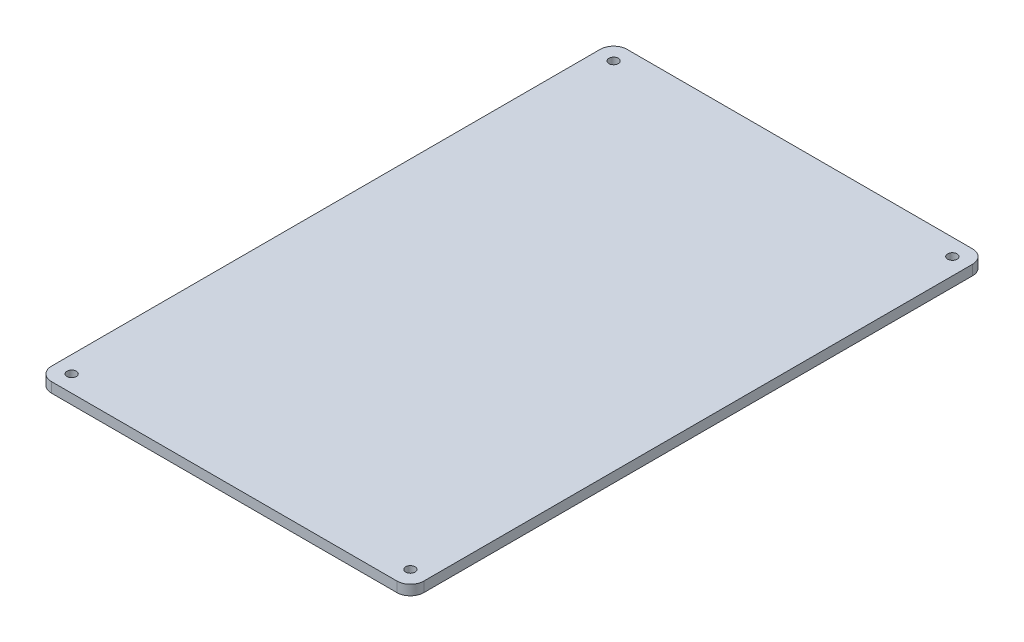
ISO-10303-21;
HEADER;
FILE_DESCRIPTION(('STEP AP214'),'2;1');
FILE_NAME('part.step','',(''),(''),'','','');
FILE_SCHEMA(('AUTOMOTIVE_DESIGN { 1 0 10303 214 1 1 1 1 }'));
ENDSEC;
DATA;
#1=APPLICATION_CONTEXT('core data for automotive mechanical design processes');
#2=APPLICATION_PROTOCOL_DEFINITION('international standard','automotive_design',2000,#1);
#3=PRODUCT_CONTEXT('',#1,'mechanical');
#4=PRODUCT('Part','Part','',(#3));
#5=PRODUCT_RELATED_PRODUCT_CATEGORY('part','',(#4));
#6=PRODUCT_DEFINITION_FORMATION('','',#4);
#7=PRODUCT_DEFINITION_CONTEXT('part definition',#1,'design');
#8=PRODUCT_DEFINITION('design','',#6,#7);
#9=PRODUCT_DEFINITION_SHAPE('','',#8);
#10=(LENGTH_UNIT() NAMED_UNIT(*) SI_UNIT(.MILLI.,.METRE.));
#11=(NAMED_UNIT(*) PLANE_ANGLE_UNIT() SI_UNIT($,.RADIAN.));
#12=(NAMED_UNIT(*) SI_UNIT($,.STERADIAN.) SOLID_ANGLE_UNIT());
#13=UNCERTAINTY_MEASURE_WITH_UNIT(LENGTH_MEASURE(1.E-05),#10,'distance_accuracy_value','');
#14=(GEOMETRIC_REPRESENTATION_CONTEXT(3) GLOBAL_UNCERTAINTY_ASSIGNED_CONTEXT((#13)) GLOBAL_UNIT_ASSIGNED_CONTEXT((#10,
#11,#12)) REPRESENTATION_CONTEXT('',''));
#15=CARTESIAN_POINT('',(0.,0.,0.));
#16=DIRECTION('',(0.,0.,1.));
#17=DIRECTION('',(1.,0.,0.));
#18=AXIS2_PLACEMENT_3D('',#15,#16,#17);
#19=CARTESIAN_POINT('',(-51.5,3.,-80.5789626486851));
#20=DIRECTION('',(0.,-1.,0.));
#21=DIRECTION('',(0.,0.,-1.));
#22=AXIS2_PLACEMENT_3D('',#19,#20,#21);
#23=CYLINDRICAL_SURFACE('',#22,4.);
#24=CARTESIAN_POINT('',(-51.5,0.,-80.5789626486851));
#25=DIRECTION('',(0.,1.,0.));
#26=DIRECTION('',(0.,0.,1.));
#27=AXIS2_PLACEMENT_3D('',#24,#25,#26);
#28=CIRCLE('',#27,4.);
#29=CARTESIAN_POINT('',(-55.5,0.,-80.578962648685));
#30=VERTEX_POINT('',#29);
#31=CARTESIAN_POINT('',(-51.5,0.,-84.5789626486851));
#32=VERTEX_POINT('',#31);
#33=EDGE_CURVE('E141',#30,#32,#28,.F.);
#34=ORIENTED_EDGE('',*,*,#33,.F.);
#35=DIRECTION('',(0.,-1.,0.));
#36=VECTOR('',#35,1.);
#37=CARTESIAN_POINT('',(-55.5,3.,-80.578962648685));
#38=LINE('',#37,#36);
#39=CARTESIAN_POINT('',(-55.5,3.,-80.578962648685));
#40=VERTEX_POINT('',#39);
#41=EDGE_CURVE('E11',#40,#30,#38,.T.);
#42=ORIENTED_EDGE('',*,*,#41,.F.);
#43=CARTESIAN_POINT('',(-51.5,3.,-80.5789626486851));
#44=DIRECTION('',(0.,1.,0.));
#45=DIRECTION('',(0.,0.,1.));
#46=AXIS2_PLACEMENT_3D('',#43,#44,#45);
#47=CIRCLE('',#46,4.);
#48=CARTESIAN_POINT('',(-51.5,3.,-84.5789626486851));
#49=VERTEX_POINT('',#48);
#50=EDGE_CURVE('E168',#40,#49,#47,.F.);
#51=ORIENTED_EDGE('',*,*,#50,.T.);
#52=DIRECTION('',(0.,-1.,0.));
#53=VECTOR('',#52,1.);
#54=CARTESIAN_POINT('',(-51.5,3.,-84.5789626486851));
#55=LINE('',#54,#53);
#56=EDGE_CURVE('E86',#49,#32,#55,.T.);
#57=ORIENTED_EDGE('',*,*,#56,.T.);
#58=EDGE_LOOP('',(#34,#42,#51,#57));
#59=FACE_BOUND('',#58,.T.);
#60=ADVANCED_FACE('F35',(#59),#23,.T.);
#61=CARTESIAN_POINT('',(-55.5,3.,0.));
#62=DIRECTION('',(1.,0.,0.));
#63=DIRECTION('',(0.,0.,-1.));
#64=AXIS2_PLACEMENT_3D('',#61,#62,#63);
#65=PLANE('',#64);
#66=DIRECTION('',(0.,0.,1.));
#67=VECTOR('',#66,1.);
#68=CARTESIAN_POINT('',(-55.5,0.,0.));
#69=LINE('',#68,#67);
#70=CARTESIAN_POINT('',(-55.5,0.,83.0177691164296));
#71=VERTEX_POINT('',#70);
#72=EDGE_CURVE('E144',#30,#71,#69,.T.);
#73=ORIENTED_EDGE('',*,*,#72,.T.);
#74=DIRECTION('',(0.,-1.,0.));
#75=VECTOR('',#74,1.);
#76=CARTESIAN_POINT('',(-55.5,3.,83.0177691164296));
#77=LINE('',#76,#75);
#78=CARTESIAN_POINT('',(-55.5,3.,83.0177691164296));
#79=VERTEX_POINT('',#78);
#80=EDGE_CURVE('E43',#79,#71,#77,.T.);
#81=ORIENTED_EDGE('',*,*,#80,.F.);
#82=DIRECTION('',(0.,0.,1.));
#83=VECTOR('',#82,1.);
#84=CARTESIAN_POINT('',(-55.5,3.,0.));
#85=LINE('',#84,#83);
#86=EDGE_CURVE('E202',#40,#79,#85,.T.);
#87=ORIENTED_EDGE('',*,*,#86,.F.);
#88=ORIENTED_EDGE('',*,*,#41,.T.);
#89=EDGE_LOOP('',(#73,#81,#87,#88));
#90=FACE_BOUND('',#89,.T.);
#91=ADVANCED_FACE('F204',(#90),#65,.F.);
#92=CARTESIAN_POINT('',(-51.5,3.,83.0177691164297));
#93=DIRECTION('',(0.,-1.,0.));
#94=DIRECTION('',(0.,0.,-1.));
#95=AXIS2_PLACEMENT_3D('',#92,#93,#94);
#96=CYLINDRICAL_SURFACE('',#95,4.);
#97=CARTESIAN_POINT('',(-51.5,0.,83.0177691164297));
#98=DIRECTION('',(0.,1.,0.));
#99=DIRECTION('',(0.,0.,1.));
#100=AXIS2_PLACEMENT_3D('',#97,#98,#99);
#101=CIRCLE('',#100,4.);
#102=CARTESIAN_POINT('',(-51.5,0.,87.0177691164297));
#103=VERTEX_POINT('',#102);
#104=EDGE_CURVE('E146',#71,#103,#101,.T.);
#105=ORIENTED_EDGE('',*,*,#104,.T.);
#106=DIRECTION('',(0.,-1.,0.));
#107=VECTOR('',#106,1.);
#108=CARTESIAN_POINT('',(-51.5,3.,87.0177691164297));
#109=LINE('',#108,#107);
#110=CARTESIAN_POINT('',(-51.5,3.,87.0177691164297));
#111=VERTEX_POINT('',#110);
#112=EDGE_CURVE('E175',#111,#103,#109,.T.);
#113=ORIENTED_EDGE('',*,*,#112,.F.);
#114=CARTESIAN_POINT('',(-51.5,3.,83.0177691164297));
#115=DIRECTION('',(0.,1.,0.));
#116=DIRECTION('',(0.,0.,1.));
#117=AXIS2_PLACEMENT_3D('',#114,#115,#116);
#118=CIRCLE('',#117,4.);
#119=EDGE_CURVE('E184',#79,#111,#118,.T.);
#120=ORIENTED_EDGE('',*,*,#119,.F.);
#121=ORIENTED_EDGE('',*,*,#80,.T.);
#122=EDGE_LOOP('',(#105,#113,#120,#121));
#123=FACE_BOUND('',#122,.T.);
#124=ADVANCED_FACE('F182',(#123),#96,.T.);
#125=CARTESIAN_POINT('',(0.,3.,87.0177691164297));
#126=DIRECTION('',(0.,0.,-1.));
#127=DIRECTION('',(-1.,0.,0.));
#128=AXIS2_PLACEMENT_3D('',#125,#126,#127);
#129=PLANE('',#128);
#130=DIRECTION('',(1.,0.,0.));
#131=VECTOR('',#130,1.);
#132=CARTESIAN_POINT('',(0.,0.,87.0177691164297));
#133=LINE('',#132,#131);
#134=CARTESIAN_POINT('',(51.5,0.,87.0177691164297));
#135=VERTEX_POINT('',#134);
#136=EDGE_CURVE('E148',#103,#135,#133,.T.);
#137=ORIENTED_EDGE('',*,*,#136,.T.);
#138=DIRECTION('',(0.,-1.,0.));
#139=VECTOR('',#138,1.);
#140=CARTESIAN_POINT('',(51.5,3.,87.0177691164297));
#141=LINE('',#140,#139);
#142=CARTESIAN_POINT('',(51.5,3.,87.0177691164297));
#143=VERTEX_POINT('',#142);
#144=EDGE_CURVE('E172',#143,#135,#141,.T.);
#145=ORIENTED_EDGE('',*,*,#144,.F.);
#146=DIRECTION('',(1.,0.,0.));
#147=VECTOR('',#146,1.);
#148=CARTESIAN_POINT('',(0.,3.,87.0177691164297));
#149=LINE('',#148,#147);
#150=EDGE_CURVE('E198',#111,#143,#149,.T.);
#151=ORIENTED_EDGE('',*,*,#150,.F.);
#152=ORIENTED_EDGE('',*,*,#112,.T.);
#153=EDGE_LOOP('',(#137,#145,#151,#152));
#154=FACE_BOUND('',#153,.T.);
#155=ADVANCED_FACE('F194',(#154),#129,.F.);
#156=CARTESIAN_POINT('',(51.5,3.,83.0177691164297));
#157=DIRECTION('',(0.,-1.,0.));
#158=DIRECTION('',(0.,0.,-1.));
#159=AXIS2_PLACEMENT_3D('',#156,#157,#158);
#160=CYLINDRICAL_SURFACE('',#159,4.);
#161=CARTESIAN_POINT('',(51.5,0.,83.0177691164297));
#162=DIRECTION('',(0.,1.,0.));
#163=DIRECTION('',(0.,0.,1.));
#164=AXIS2_PLACEMENT_3D('',#161,#162,#163);
#165=CIRCLE('',#164,4.);
#166=CARTESIAN_POINT('',(55.5,0.,83.0177691164296));
#167=VERTEX_POINT('',#166);
#168=EDGE_CURVE('E150',#135,#167,#165,.T.);
#169=ORIENTED_EDGE('',*,*,#168,.T.);
#170=DIRECTION('',(0.,-1.,0.));
#171=VECTOR('',#170,1.);
#172=CARTESIAN_POINT('',(55.5,3.,83.0177691164296));
#173=LINE('',#172,#171);
#174=CARTESIAN_POINT('',(55.5,3.,83.0177691164296));
#175=VERTEX_POINT('',#174);
#176=EDGE_CURVE('E121',#175,#167,#173,.T.);
#177=ORIENTED_EDGE('',*,*,#176,.F.);
#178=CARTESIAN_POINT('',(51.5,3.,83.0177691164297));
#179=DIRECTION('',(0.,1.,0.));
#180=DIRECTION('',(0.,0.,1.));
#181=AXIS2_PLACEMENT_3D('',#178,#179,#180);
#182=CIRCLE('',#181,4.);
#183=EDGE_CURVE('E112',#143,#175,#182,.T.);
#184=ORIENTED_EDGE('',*,*,#183,.F.);
#185=ORIENTED_EDGE('',*,*,#144,.T.);
#186=EDGE_LOOP('',(#169,#177,#184,#185));
#187=FACE_BOUND('',#186,.T.);
#188=ADVANCED_FACE('F197',(#187),#160,.T.);
#189=CARTESIAN_POINT('',(55.5,3.,0.));
#190=DIRECTION('',(-1.,0.,0.));
#191=DIRECTION('',(0.,0.,1.));
#192=AXIS2_PLACEMENT_3D('',#189,#190,#191);
#193=PLANE('',#192);
#194=DIRECTION('',(0.,0.,-1.));
#195=VECTOR('',#194,1.);
#196=CARTESIAN_POINT('',(55.5,0.,0.));
#197=LINE('',#196,#195);
#198=CARTESIAN_POINT('',(55.5,0.,-80.578962648685));
#199=VERTEX_POINT('',#198);
#200=EDGE_CURVE('E120',#167,#199,#197,.T.);
#201=ORIENTED_EDGE('',*,*,#200,.T.);
#202=DIRECTION('',(0.,-1.,0.));
#203=VECTOR('',#202,1.);
#204=CARTESIAN_POINT('',(55.5,3.,-80.578962648685));
#205=LINE('',#204,#203);
#206=CARTESIAN_POINT('',(55.5,3.,-80.578962648685));
#207=VERTEX_POINT('',#206);
#208=EDGE_CURVE('E117',#207,#199,#205,.T.);
#209=ORIENTED_EDGE('',*,*,#208,.F.);
#210=DIRECTION('',(0.,0.,-1.));
#211=VECTOR('',#210,1.);
#212=CARTESIAN_POINT('',(55.5,3.,0.));
#213=LINE('',#212,#211);
#214=EDGE_CURVE('E105',#175,#207,#213,.T.);
#215=ORIENTED_EDGE('',*,*,#214,.F.);
#216=ORIENTED_EDGE('',*,*,#176,.T.);
#217=EDGE_LOOP('',(#201,#209,#215,#216));
#218=FACE_BOUND('',#217,.T.);
#219=ADVANCED_FACE('F118',(#218),#193,.F.);
#220=CARTESIAN_POINT('',(51.5,3.,-80.5789626486851));
#221=DIRECTION('',(0.,-1.,0.));
#222=DIRECTION('',(0.,0.,-1.));
#223=AXIS2_PLACEMENT_3D('',#220,#221,#222);
#224=CYLINDRICAL_SURFACE('',#223,4.);
#225=CARTESIAN_POINT('',(51.5,0.,-80.5789626486851));
#226=DIRECTION('',(0.,1.,0.));
#227=DIRECTION('',(0.,0.,1.));
#228=AXIS2_PLACEMENT_3D('',#225,#226,#227);
#229=CIRCLE('',#228,4.);
#230=CARTESIAN_POINT('',(51.5,0.,-84.5789626486851));
#231=VERTEX_POINT('',#230);
#232=EDGE_CURVE('E79',#199,#231,#229,.T.);
#233=ORIENTED_EDGE('',*,*,#232,.T.);
#234=DIRECTION('',(0.,-1.,0.));
#235=VECTOR('',#234,1.);
#236=CARTESIAN_POINT('',(51.5,3.,-84.5789626486851));
#237=LINE('',#236,#235);
#238=CARTESIAN_POINT('',(51.5,3.,-84.5789626486851));
#239=VERTEX_POINT('',#238);
#240=EDGE_CURVE('E122',#239,#231,#237,.T.);
#241=ORIENTED_EDGE('',*,*,#240,.F.);
#242=CARTESIAN_POINT('',(51.5,3.,-80.5789626486851));
#243=DIRECTION('',(0.,1.,0.));
#244=DIRECTION('',(0.,0.,1.));
#245=AXIS2_PLACEMENT_3D('',#242,#243,#244);
#246=CIRCLE('',#245,4.);
#247=EDGE_CURVE('E110',#207,#239,#246,.T.);
#248=ORIENTED_EDGE('',*,*,#247,.F.);
#249=ORIENTED_EDGE('',*,*,#208,.T.);
#250=EDGE_LOOP('',(#233,#241,#248,#249));
#251=FACE_BOUND('',#250,.T.);
#252=ADVANCED_FACE('F124',(#251),#224,.T.);
#253=CARTESIAN_POINT('',(50.5,3.,82.0177691164297));
#254=DIRECTION('',(0.,-1.,0.));
#255=DIRECTION('',(0.,0.,-1.));
#256=AXIS2_PLACEMENT_3D('',#253,#254,#255);
#257=CYLINDRICAL_SURFACE('',#256,1.39999999999998);
#258=CARTESIAN_POINT('',(50.5,3.,82.0177691164297));
#259=DIRECTION('',(0.,1.,0.));
#260=DIRECTION('',(0.,0.,1.));
#261=AXIS2_PLACEMENT_3D('',#258,#259,#260);
#262=CIRCLE('',#261,1.39999999999998);
#263=CARTESIAN_POINT('',(50.5,3.,83.4177691164297));
#264=VERTEX_POINT('',#263);
#265=EDGE_CURVE('E135',#264,#264,#262,.T.);
#266=ORIENTED_EDGE('',*,*,#265,.T.);
#267=EDGE_LOOP('',(#266));
#268=FACE_BOUND('',#267,.T.);
#269=CARTESIAN_POINT('',(50.5,0.,82.0177691164297));
#270=DIRECTION('',(0.,1.,0.));
#271=DIRECTION('',(0.,0.,1.));
#272=AXIS2_PLACEMENT_3D('',#269,#270,#271);
#273=CIRCLE('',#272,1.39999999999998);
#274=CARTESIAN_POINT('',(50.5,0.,83.4177691164297));
#275=VERTEX_POINT('',#274);
#276=EDGE_CURVE('E162',#275,#275,#273,.T.);
#277=ORIENTED_EDGE('',*,*,#276,.F.);
#278=EDGE_LOOP('',(#277));
#279=FACE_BOUND('',#278,.T.);
#280=ADVANCED_FACE('F220',(#268,#279),#257,.F.);
#281=CARTESIAN_POINT('',(50.5,3.,-79.5789626486851));
#282=DIRECTION('',(0.,-1.,0.));
#283=DIRECTION('',(0.,0.,-1.));
#284=AXIS2_PLACEMENT_3D('',#281,#282,#283);
#285=CYLINDRICAL_SURFACE('',#284,1.39999999999997);
#286=CARTESIAN_POINT('',(50.5,3.,-79.5789626486851));
#287=DIRECTION('',(0.,1.,0.));
#288=DIRECTION('',(0.,0.,1.));
#289=AXIS2_PLACEMENT_3D('',#286,#287,#288);
#290=CIRCLE('',#289,1.39999999999997);
#291=CARTESIAN_POINT('',(50.5,3.,-78.1789626486851));
#292=VERTEX_POINT('',#291);
#293=EDGE_CURVE('E132',#292,#292,#290,.T.);
#294=ORIENTED_EDGE('',*,*,#293,.T.);
#295=EDGE_LOOP('',(#294));
#296=FACE_BOUND('',#295,.T.);
#297=CARTESIAN_POINT('',(50.5,0.,-79.5789626486851));
#298=DIRECTION('',(0.,1.,0.));
#299=DIRECTION('',(0.,0.,1.));
#300=AXIS2_PLACEMENT_3D('',#297,#298,#299);
#301=CIRCLE('',#300,1.39999999999997);
#302=CARTESIAN_POINT('',(50.5,0.,-78.1789626486851));
#303=VERTEX_POINT('',#302);
#304=EDGE_CURVE('E159',#303,#303,#301,.T.);
#305=ORIENTED_EDGE('',*,*,#304,.F.);
#306=EDGE_LOOP('',(#305));
#307=FACE_BOUND('',#306,.T.);
#308=ADVANCED_FACE('F229',(#296,#307),#285,.F.);
#309=CARTESIAN_POINT('',(-50.5,3.,-79.5789626486851));
#310=DIRECTION('',(0.,-1.,0.));
#311=DIRECTION('',(0.,0.,-1.));
#312=AXIS2_PLACEMENT_3D('',#309,#310,#311);
#313=CYLINDRICAL_SURFACE('',#312,1.40000000000001);
#314=CARTESIAN_POINT('',(-50.5,3.,-79.5789626486851));
#315=DIRECTION('',(0.,1.,0.));
#316=DIRECTION('',(0.,0.,1.));
#317=AXIS2_PLACEMENT_3D('',#314,#315,#316);
#318=CIRCLE('',#317,1.40000000000001);
#319=CARTESIAN_POINT('',(-50.5,3.,-78.1789626486851));
#320=VERTEX_POINT('',#319);
#321=EDGE_CURVE('E126',#320,#320,#318,.T.);
#322=ORIENTED_EDGE('',*,*,#321,.T.);
#323=EDGE_LOOP('',(#322));
#324=FACE_BOUND('',#323,.T.);
#325=CARTESIAN_POINT('',(-50.5,0.,-79.5789626486851));
#326=DIRECTION('',(0.,1.,0.));
#327=DIRECTION('',(0.,0.,1.));
#328=AXIS2_PLACEMENT_3D('',#325,#326,#327);
#329=CIRCLE('',#328,1.40000000000001);
#330=CARTESIAN_POINT('',(-50.5,0.,-78.1789626486851));
#331=VERTEX_POINT('',#330);
#332=EDGE_CURVE('E156',#331,#331,#329,.T.);
#333=ORIENTED_EDGE('',*,*,#332,.F.);
#334=EDGE_LOOP('',(#333));
#335=FACE_BOUND('',#334,.T.);
#336=ADVANCED_FACE('F225',(#324,#335),#313,.F.);
#337=CARTESIAN_POINT('',(0.,3.,-84.5789626486851));
#338=DIRECTION('',(0.,0.,1.));
#339=DIRECTION('',(1.,0.,0.));
#340=AXIS2_PLACEMENT_3D('',#337,#338,#339);
#341=PLANE('',#340);
#342=DIRECTION('',(-1.,0.,0.));
#343=VECTOR('',#342,1.);
#344=CARTESIAN_POINT('',(0.,0.,-84.5789626486851));
#345=LINE('',#344,#343);
#346=EDGE_CURVE('E154',#231,#32,#345,.T.);
#347=ORIENTED_EDGE('',*,*,#346,.T.);
#348=ORIENTED_EDGE('',*,*,#56,.F.);
#349=DIRECTION('',(-1.,0.,0.));
#350=VECTOR('',#349,1.);
#351=CARTESIAN_POINT('',(0.,3.,-84.5789626486851));
#352=LINE('',#351,#350);
#353=EDGE_CURVE('E51',#239,#49,#352,.T.);
#354=ORIENTED_EDGE('',*,*,#353,.F.);
#355=ORIENTED_EDGE('',*,*,#240,.T.);
#356=EDGE_LOOP('',(#347,#348,#354,#355));
#357=FACE_BOUND('',#356,.T.);
#358=ADVANCED_FACE('F221',(#357),#341,.F.);
#359=CARTESIAN_POINT('',(-50.5,3.,82.0177691164297));
#360=DIRECTION('',(0.,-1.,0.));
#361=DIRECTION('',(0.,0.,-1.));
#362=AXIS2_PLACEMENT_3D('',#359,#360,#361);
#363=CYLINDRICAL_SURFACE('',#362,1.4);
#364=CARTESIAN_POINT('',(-50.5,3.,82.0177691164297));
#365=DIRECTION('',(0.,1.,0.));
#366=DIRECTION('',(0.,0.,1.));
#367=AXIS2_PLACEMENT_3D('',#364,#365,#366);
#368=CIRCLE('',#367,1.4);
#369=CARTESIAN_POINT('',(-50.5,3.,83.4177691164297));
#370=VERTEX_POINT('',#369);
#371=EDGE_CURVE('E138',#370,#370,#368,.T.);
#372=ORIENTED_EDGE('',*,*,#371,.T.);
#373=EDGE_LOOP('',(#372));
#374=FACE_BOUND('',#373,.T.);
#375=CARTESIAN_POINT('',(-50.5,0.,82.0177691164297));
#376=DIRECTION('',(0.,1.,0.));
#377=DIRECTION('',(0.,0.,1.));
#378=AXIS2_PLACEMENT_3D('',#375,#376,#377);
#379=CIRCLE('',#378,1.4);
#380=CARTESIAN_POINT('',(-50.5,0.,83.4177691164297));
#381=VERTEX_POINT('',#380);
#382=EDGE_CURVE('E165',#381,#381,#379,.T.);
#383=ORIENTED_EDGE('',*,*,#382,.F.);
#384=EDGE_LOOP('',(#383));
#385=FACE_BOUND('',#384,.T.);
#386=ADVANCED_FACE('F224',(#374,#385),#363,.F.);
#387=CARTESIAN_POINT('',(0.,3.,0.));
#388=DIRECTION('',(0.,1.,0.));
#389=DIRECTION('',(0.,0.,1.));
#390=AXIS2_PLACEMENT_3D('',#387,#388,#389);
#391=PLANE('',#390);
#392=ORIENTED_EDGE('',*,*,#50,.F.);
#393=ORIENTED_EDGE('',*,*,#86,.T.);
#394=ORIENTED_EDGE('',*,*,#119,.T.);
#395=ORIENTED_EDGE('',*,*,#150,.T.);
#396=ORIENTED_EDGE('',*,*,#183,.T.);
#397=ORIENTED_EDGE('',*,*,#214,.T.);
#398=ORIENTED_EDGE('',*,*,#247,.T.);
#399=ORIENTED_EDGE('',*,*,#353,.T.);
#400=EDGE_LOOP('',(#392,#393,#394,#395,#396,#397,#398,#399));
#401=FACE_BOUND('',#400,.T.);
#402=ORIENTED_EDGE('',*,*,#321,.F.);
#403=EDGE_LOOP('',(#402));
#404=FACE_BOUND('',#403,.T.);
#405=ORIENTED_EDGE('',*,*,#293,.F.);
#406=EDGE_LOOP('',(#405));
#407=FACE_BOUND('',#406,.T.);
#408=ORIENTED_EDGE('',*,*,#265,.F.);
#409=EDGE_LOOP('',(#408));
#410=FACE_BOUND('',#409,.T.);
#411=ORIENTED_EDGE('',*,*,#371,.F.);
#412=EDGE_LOOP('',(#411));
#413=FACE_BOUND('',#412,.T.);
#414=ADVANCED_FACE('F107',(#401,#404,#407,#410,#413),#391,.T.);
#415=CARTESIAN_POINT('',(0.,0.,0.));
#416=DIRECTION('',(0.,1.,0.));
#417=DIRECTION('',(0.,0.,1.));
#418=AXIS2_PLACEMENT_3D('',#415,#416,#417);
#419=PLANE('',#418);
#420=ORIENTED_EDGE('',*,*,#33,.T.);
#421=ORIENTED_EDGE('',*,*,#346,.F.);
#422=ORIENTED_EDGE('',*,*,#232,.F.);
#423=ORIENTED_EDGE('',*,*,#200,.F.);
#424=ORIENTED_EDGE('',*,*,#168,.F.);
#425=ORIENTED_EDGE('',*,*,#136,.F.);
#426=ORIENTED_EDGE('',*,*,#104,.F.);
#427=ORIENTED_EDGE('',*,*,#72,.F.);
#428=EDGE_LOOP('',(#420,#421,#422,#423,#424,#425,#426,#427));
#429=FACE_BOUND('',#428,.T.);
#430=ORIENTED_EDGE('',*,*,#332,.T.);
#431=EDGE_LOOP('',(#430));
#432=FACE_BOUND('',#431,.T.);
#433=ORIENTED_EDGE('',*,*,#304,.T.);
#434=EDGE_LOOP('',(#433));
#435=FACE_BOUND('',#434,.T.);
#436=ORIENTED_EDGE('',*,*,#276,.T.);
#437=EDGE_LOOP('',(#436));
#438=FACE_BOUND('',#437,.T.);
#439=ORIENTED_EDGE('',*,*,#382,.T.);
#440=EDGE_LOOP('',(#439));
#441=FACE_BOUND('',#440,.T.);
#442=ADVANCED_FACE('F189',(#429,#432,#435,#438,#441),#419,.F.);
#443=CLOSED_SHELL('',(#60,#91,#124,#155,#188,#219,#252,#280,#308,#336,#358,#386,#414,#442));
#444=MANIFOLD_SOLID_BREP('B2',#443);
#445=ADVANCED_BREP_SHAPE_REPRESENTATION('',(#18,#444),#14);
#446=SHAPE_DEFINITION_REPRESENTATION(#9,#445);
ENDSEC;
END-ISO-10303-21;
